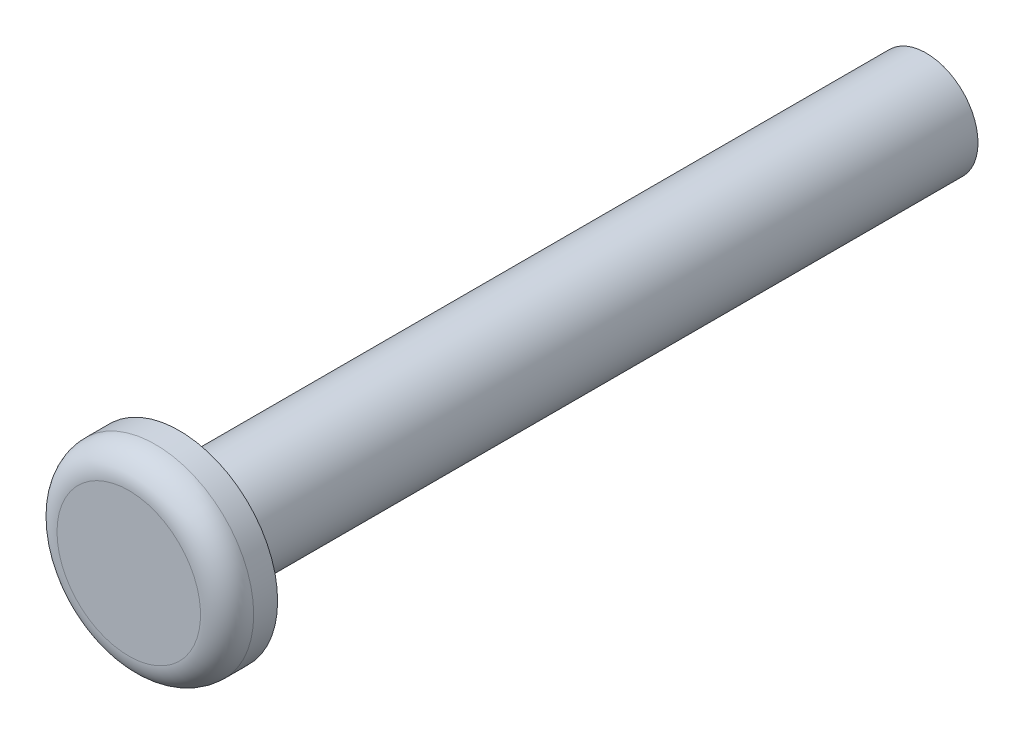
ISO-10303-21;
HEADER;
FILE_DESCRIPTION(('STEP AP214'),'2;1');
FILE_NAME('part.step','',(''),(''),'','','');
FILE_SCHEMA(('AUTOMOTIVE_DESIGN { 1 0 10303 214 1 1 1 1 }'));
ENDSEC;
DATA;
#1=APPLICATION_CONTEXT('core data for automotive mechanical design processes');
#2=APPLICATION_PROTOCOL_DEFINITION('international standard','automotive_design',2000,#1);
#3=PRODUCT_CONTEXT('',#1,'mechanical');
#4=PRODUCT('Part','Part','',(#3));
#5=PRODUCT_RELATED_PRODUCT_CATEGORY('part','',(#4));
#6=PRODUCT_DEFINITION_FORMATION('','',#4);
#7=PRODUCT_DEFINITION_CONTEXT('part definition',#1,'design');
#8=PRODUCT_DEFINITION('design','',#6,#7);
#9=PRODUCT_DEFINITION_SHAPE('','',#8);
#10=(LENGTH_UNIT() NAMED_UNIT(*) SI_UNIT(.MILLI.,.METRE.));
#11=(NAMED_UNIT(*) PLANE_ANGLE_UNIT() SI_UNIT($,.RADIAN.));
#12=(NAMED_UNIT(*) SI_UNIT($,.STERADIAN.) SOLID_ANGLE_UNIT());
#13=UNCERTAINTY_MEASURE_WITH_UNIT(LENGTH_MEASURE(1.E-05),#10,'distance_accuracy_value','');
#14=(GEOMETRIC_REPRESENTATION_CONTEXT(3) GLOBAL_UNCERTAINTY_ASSIGNED_CONTEXT((#13)) GLOBAL_UNIT_ASSIGNED_CONTEXT((#10,
#11,#12)) REPRESENTATION_CONTEXT('',''));
#15=CARTESIAN_POINT('',(0.,0.,0.));
#16=DIRECTION('',(0.,0.,1.));
#17=DIRECTION('',(1.,0.,0.));
#18=AXIS2_PLACEMENT_3D('',#15,#16,#17);
#19=CARTESIAN_POINT('',(0.,3.7,0.));
#20=DIRECTION('',(0.,0.,-1.));
#21=DIRECTION('',(-1.,0.,0.));
#22=AXIS2_PLACEMENT_3D('',#19,#20,#21);
#23=PLANE('',#22);
#24=CARTESIAN_POINT('',(0.,0.,0.));
#25=DIRECTION('',(0.,0.,-1.));
#26=DIRECTION('',(-1.,0.,0.));
#27=AXIS2_PLACEMENT_3D('',#24,#25,#26);
#28=CIRCLE('',#27,2.7);
#29=CARTESIAN_POINT('',(-2.7,0.,0.));
#30=VERTEX_POINT('',#29);
#31=EDGE_CURVE('E37',#30,#30,#28,.F.);
#32=ORIENTED_EDGE('',*,*,#31,.T.);
#33=EDGE_LOOP('',(#32));
#34=FACE_BOUND('',#33,.T.);
#35=ADVANCED_FACE('F30',(#34),#23,.F.);
#36=CARTESIAN_POINT('',(0.,0.,-30.));
#37=DIRECTION('',(0.,0.,1.));
#38=DIRECTION('',(1.,0.,0.));
#39=AXIS2_PLACEMENT_3D('',#36,#37,#38);
#40=PLANE('',#39);
#41=CARTESIAN_POINT('',(0.,0.,-30.));
#42=DIRECTION('',(0.,0.,1.));
#43=DIRECTION('',(1.,0.,0.));
#44=AXIS2_PLACEMENT_3D('',#41,#42,#43);
#45=CIRCLE('',#44,1.95);
#46=CARTESIAN_POINT('',(1.95,0.,-30.));
#47=VERTEX_POINT('',#46);
#48=EDGE_CURVE('E41',#47,#47,#45,.T.);
#49=ORIENTED_EDGE('',*,*,#48,.F.);
#50=EDGE_LOOP('',(#49));
#51=FACE_BOUND('',#50,.T.);
#52=ADVANCED_FACE('F65',(#51),#40,.F.);
#53=CARTESIAN_POINT('',(0.,0.,0.));
#54=DIRECTION('',(0.,0.,1.));
#55=DIRECTION('',(1.,0.,0.));
#56=AXIS2_PLACEMENT_3D('',#53,#54,#55);
#57=CYLINDRICAL_SURFACE('',#56,1.95);
#58=CARTESIAN_POINT('',(0.,0.,-1.9));
#59=DIRECTION('',(0.,0.,1.));
#60=DIRECTION('',(1.,0.,0.));
#61=AXIS2_PLACEMENT_3D('',#58,#59,#60);
#62=CIRCLE('',#61,1.95);
#63=CARTESIAN_POINT('',(1.95,0.,-1.9));
#64=VERTEX_POINT('',#63);
#65=EDGE_CURVE('E45',#64,#64,#62,.T.);
#66=ORIENTED_EDGE('',*,*,#65,.F.);
#67=EDGE_LOOP('',(#66));
#68=FACE_BOUND('',#67,.T.);
#69=ORIENTED_EDGE('',*,*,#48,.T.);
#70=EDGE_LOOP('',(#69));
#71=FACE_BOUND('',#70,.T.);
#72=ADVANCED_FACE('F59',(#68,#71),#57,.T.);
#73=CARTESIAN_POINT('',(0.,1.95,-1.9));
#74=DIRECTION('',(0.,0.,1.));
#75=DIRECTION('',(1.,0.,0.));
#76=AXIS2_PLACEMENT_3D('',#73,#74,#75);
#77=PLANE('',#76);
#78=CARTESIAN_POINT('',(0.,0.,-1.9));
#79=DIRECTION('',(0.,0.,1.));
#80=DIRECTION('',(1.,0.,0.));
#81=AXIS2_PLACEMENT_3D('',#78,#79,#80);
#82=CIRCLE('',#81,3.7);
#83=CARTESIAN_POINT('',(3.7,0.,-1.9));
#84=VERTEX_POINT('',#83);
#85=EDGE_CURVE('E50',#84,#84,#82,.T.);
#86=ORIENTED_EDGE('',*,*,#85,.F.);
#87=EDGE_LOOP('',(#86));
#88=FACE_BOUND('',#87,.T.);
#89=ORIENTED_EDGE('',*,*,#65,.T.);
#90=EDGE_LOOP('',(#89));
#91=FACE_BOUND('',#90,.T.);
#92=ADVANCED_FACE('F56',(#88,#91),#77,.F.);
#93=CARTESIAN_POINT('',(0.,0.,0.));
#94=DIRECTION('',(0.,0.,1.));
#95=DIRECTION('',(1.,0.,0.));
#96=AXIS2_PLACEMENT_3D('',#93,#94,#95);
#97=CYLINDRICAL_SURFACE('',#96,3.7);
#98=CARTESIAN_POINT('',(0.,0.,-1.));
#99=DIRECTION('',(0.,0.,-1.));
#100=DIRECTION('',(-1.,0.,0.));
#101=AXIS2_PLACEMENT_3D('',#98,#99,#100);
#102=CIRCLE('',#101,3.7);
#103=CARTESIAN_POINT('',(-3.7,0.,-1.));
#104=VERTEX_POINT('',#103);
#105=EDGE_CURVE('E10',#104,#104,#102,.T.);
#106=ORIENTED_EDGE('',*,*,#105,.T.);
#107=EDGE_LOOP('',(#106));
#108=FACE_BOUND('',#107,.T.);
#109=ORIENTED_EDGE('',*,*,#85,.T.);
#110=EDGE_LOOP('',(#109));
#111=FACE_BOUND('',#110,.T.);
#112=ADVANCED_FACE('F54',(#108,#111),#97,.T.);
#113=CARTESIAN_POINT('',(0.,0.,-1.));
#114=DIRECTION('',(0.,0.,-1.));
#115=DIRECTION('',(-1.,0.,0.));
#116=AXIS2_PLACEMENT_3D('',#113,#114,#115);
#117=TOROIDAL_SURFACE('',#116,2.7,1.);
#118=ORIENTED_EDGE('',*,*,#105,.F.);
#119=EDGE_LOOP('',(#118));
#120=FACE_BOUND('',#119,.T.);
#121=ORIENTED_EDGE('',*,*,#31,.F.);
#122=EDGE_LOOP('',(#121));
#123=FACE_BOUND('',#122,.T.);
#124=ADVANCED_FACE('F32',(#120,#123),#117,.T.);
#125=CLOSED_SHELL('',(#35,#52,#72,#92,#112,#124));
#126=MANIFOLD_SOLID_BREP('B2',#125);
#127=ADVANCED_BREP_SHAPE_REPRESENTATION('',(#18,#126),#14);
#128=SHAPE_DEFINITION_REPRESENTATION(#9,#127);
ENDSEC;
END-ISO-10303-21;
